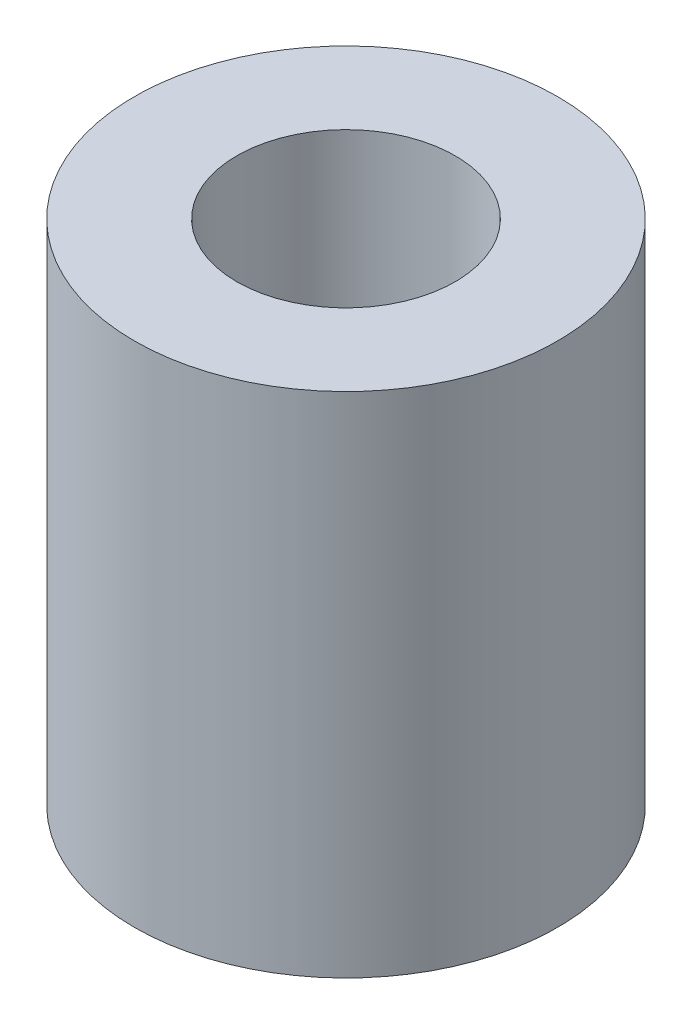
ISO-10303-21;
HEADER;
FILE_DESCRIPTION(('STEP AP214'),'2;1');
FILE_NAME('part.step','',(''),(''),'','','');
FILE_SCHEMA(('AUTOMOTIVE_DESIGN { 1 0 10303 214 1 1 1 1 }'));
ENDSEC;
DATA;
#1=APPLICATION_CONTEXT('core data for automotive mechanical design processes');
#2=APPLICATION_PROTOCOL_DEFINITION('international standard','automotive_design',2000,#1);
#3=PRODUCT_CONTEXT('',#1,'mechanical');
#4=PRODUCT('Part','Part','',(#3));
#5=PRODUCT_RELATED_PRODUCT_CATEGORY('part','',(#4));
#6=PRODUCT_DEFINITION_FORMATION('','',#4);
#7=PRODUCT_DEFINITION_CONTEXT('part definition',#1,'design');
#8=PRODUCT_DEFINITION('design','',#6,#7);
#9=PRODUCT_DEFINITION_SHAPE('','',#8);
#10=(LENGTH_UNIT() NAMED_UNIT(*) SI_UNIT(.MILLI.,.METRE.));
#11=(NAMED_UNIT(*) PLANE_ANGLE_UNIT() SI_UNIT($,.RADIAN.));
#12=(NAMED_UNIT(*) SI_UNIT($,.STERADIAN.) SOLID_ANGLE_UNIT());
#13=UNCERTAINTY_MEASURE_WITH_UNIT(LENGTH_MEASURE(1.E-05),#10,'distance_accuracy_value','');
#14=(GEOMETRIC_REPRESENTATION_CONTEXT(3) GLOBAL_UNCERTAINTY_ASSIGNED_CONTEXT((#13)) GLOBAL_UNIT_ASSIGNED_CONTEXT((#10,
#11,#12)) REPRESENTATION_CONTEXT('',''));
#15=CARTESIAN_POINT('',(0.,0.,0.));
#16=DIRECTION('',(0.,0.,1.));
#17=DIRECTION('',(1.,0.,0.));
#18=AXIS2_PLACEMENT_3D('',#15,#16,#17);
#19=CARTESIAN_POINT('',(0.,7.62,0.));
#20=DIRECTION('',(0.,-1.,0.));
#21=DIRECTION('',(0.,0.,-1.));
#22=AXIS2_PLACEMENT_3D('',#19,#20,#21);
#23=CYLINDRICAL_SURFACE('',#22,3.175);
#24=CARTESIAN_POINT('',(0.,7.62,0.));
#25=DIRECTION('',(0.,1.,0.));
#26=DIRECTION('',(0.,0.,1.));
#27=AXIS2_PLACEMENT_3D('',#24,#25,#26);
#28=CIRCLE('',#27,3.175);
#29=CARTESIAN_POINT('',(0.,7.62,-3.175));
#30=VERTEX_POINT('',#29);
#31=EDGE_CURVE('E10',#30,#30,#28,.T.);
#32=CARTESIAN_POINT('',(0.,0.,0.));
#33=DIRECTION('',(0.,1.,0.));
#34=DIRECTION('',(0.,0.,1.));
#35=AXIS2_PLACEMENT_3D('',#32,#33,#34);
#36=CIRCLE('',#35,3.175);
#37=CARTESIAN_POINT('',(0.,0.,-3.175));
#38=VERTEX_POINT('',#37);
#39=EDGE_CURVE('E35',#38,#38,#36,.T.);
#40=CARTESIAN_POINT('',(0.,7.62,-3.175));
#41=CARTESIAN_POINT('',(0.,7.540625,-3.175));
#42=CARTESIAN_POINT('',(0.,7.46125,-3.175));
#43=CARTESIAN_POINT('',(0.,7.3025,-3.175));
#44=CARTESIAN_POINT('',(0.,7.223125,-3.175));
#45=CARTESIAN_POINT('',(0.,7.064375,-3.175));
#46=CARTESIAN_POINT('',(0.,6.985,-3.175));
#47=CARTESIAN_POINT('',(0.,6.82625,-3.175));
#48=CARTESIAN_POINT('',(0.,6.746875,-3.175));
#49=CARTESIAN_POINT('',(0.,6.588125,-3.175));
#50=CARTESIAN_POINT('',(0.,6.50875,-3.175));
#51=CARTESIAN_POINT('',(0.,6.35,-3.175));
#52=CARTESIAN_POINT('',(0.,6.270625,-3.175));
#53=CARTESIAN_POINT('',(0.,6.111875,-3.175));
#54=CARTESIAN_POINT('',(0.,6.0325,-3.175));
#55=CARTESIAN_POINT('',(0.,5.87375,-3.175));
#56=CARTESIAN_POINT('',(0.,5.794375,-3.175));
#57=CARTESIAN_POINT('',(0.,5.635625,-3.175));
#58=CARTESIAN_POINT('',(0.,5.55625,-3.175));
#59=CARTESIAN_POINT('',(0.,5.3975,-3.175));
#60=CARTESIAN_POINT('',(0.,5.318125,-3.175));
#61=CARTESIAN_POINT('',(0.,5.159375,-3.175));
#62=CARTESIAN_POINT('',(0.,5.08,-3.175));
#63=CARTESIAN_POINT('',(0.,4.92125,-3.175));
#64=CARTESIAN_POINT('',(0.,4.841875,-3.175));
#65=CARTESIAN_POINT('',(0.,4.683125,-3.175));
#66=CARTESIAN_POINT('',(0.,4.60375,-3.175));
#67=CARTESIAN_POINT('',(0.,4.445,-3.175));
#68=CARTESIAN_POINT('',(0.,4.365625,-3.175));
#69=CARTESIAN_POINT('',(0.,4.206875,-3.175));
#70=CARTESIAN_POINT('',(0.,4.1275,-3.175));
#71=CARTESIAN_POINT('',(0.,3.96875,-3.175));
#72=CARTESIAN_POINT('',(0.,3.889375,-3.175));
#73=CARTESIAN_POINT('',(0.,3.730625,-3.175));
#74=CARTESIAN_POINT('',(0.,3.65125,-3.175));
#75=CARTESIAN_POINT('',(0.,3.4925,-3.175));
#76=CARTESIAN_POINT('',(0.,3.413125,-3.175));
#77=CARTESIAN_POINT('',(0.,3.254375,-3.175));
#78=CARTESIAN_POINT('',(0.,3.175,-3.175));
#79=CARTESIAN_POINT('',(0.,3.01625,-3.175));
#80=CARTESIAN_POINT('',(0.,2.936875,-3.175));
#81=CARTESIAN_POINT('',(0.,2.778125,-3.175));
#82=CARTESIAN_POINT('',(0.,2.69875,-3.175));
#83=CARTESIAN_POINT('',(0.,2.54,-3.175));
#84=CARTESIAN_POINT('',(0.,2.460625,-3.175));
#85=CARTESIAN_POINT('',(0.,2.301875,-3.175));
#86=CARTESIAN_POINT('',(0.,2.2225,-3.175));
#87=CARTESIAN_POINT('',(0.,2.06375,-3.175));
#88=CARTESIAN_POINT('',(0.,1.984375,-3.175));
#89=CARTESIAN_POINT('',(0.,1.825625,-3.175));
#90=CARTESIAN_POINT('',(0.,1.74625,-3.175));
#91=CARTESIAN_POINT('',(0.,1.5875,-3.175));
#92=CARTESIAN_POINT('',(0.,1.508125,-3.175));
#93=CARTESIAN_POINT('',(0.,1.349375,-3.175));
#94=CARTESIAN_POINT('',(0.,1.27,-3.175));
#95=CARTESIAN_POINT('',(0.,1.11125,-3.175));
#96=CARTESIAN_POINT('',(0.,1.031875,-3.175));
#97=CARTESIAN_POINT('',(0.,0.873125,-3.175));
#98=CARTESIAN_POINT('',(0.,0.79375,-3.175));
#99=CARTESIAN_POINT('',(0.,0.635,-3.175));
#100=CARTESIAN_POINT('',(0.,0.555625,-3.175));
#101=CARTESIAN_POINT('',(0.,0.396875,-3.175));
#102=CARTESIAN_POINT('',(0.,0.3175,-3.175));
#103=CARTESIAN_POINT('',(0.,0.15875,-3.175));
#104=CARTESIAN_POINT('',(0.,0.0793749999999999,-3.175));
#105=CARTESIAN_POINT('',(0.,0.,-3.175));
#106=B_SPLINE_CURVE_WITH_KNOTS('',3,(#40,#41,#42,#43,#44,#45,#46,#47,#48,#49,#50,#51,#52,#53,
#54,#55,#56,#57,#58,#59,#60,#61,#62,#63,#64,#65,#66,#67,#68,#69,#70,#71,#72,#73,#74,#75,#76,#77,
#78,#79,#80,#81,#82,#83,#84,#85,#86,#87,#88,#89,#90,#91,#92,#93,#94,#95,#96,#97,#98,#99,#100,
#101,#102,#103,#104,#105),.UNSPECIFIED.,.F.,.F.,(4,2,2,2,2,2,2,2,2,2,2,2,2,2,2,2,2,2,2,2,2,2,2,
2,2,2,2,2,2,2,2,2,4),(0.,0.238125,0.47625,0.714375000000001,0.9525,1.190625,1.42875,1.666875,
1.905,2.143125,2.38125,2.619375,2.8575,3.095625,3.33375,3.571875,3.81,4.048125,4.28625,4.524375,
4.7625,5.000625,5.23875,5.476875,5.715,5.953125,6.19125,6.429375,6.6675,6.905625,7.14375,
7.381875,7.62),.UNSPECIFIED.);
#107=EDGE_CURVE('BSEAM32',#30,#38,#106,.T.);
#108=ORIENTED_EDGE('',*,*,#31,.F.);
#109=ORIENTED_EDGE('',*,*,#39,.T.);
#110=ORIENTED_EDGE('',*,*,#107,.T.);
#111=ORIENTED_EDGE('',*,*,#107,.F.);
#112=EDGE_LOOP('',(#108,#110,#109,#111));
#113=FACE_BOUND('',#112,.T.);
#114=ADVANCED_FACE('F32',(#113),#23,.T.);
#115=CARTESIAN_POINT('',(0.,7.62,0.));
#116=DIRECTION('',(0.,1.,0.));
#117=DIRECTION('',(0.,0.,1.));
#118=AXIS2_PLACEMENT_3D('',#115,#116,#117);
#119=PLANE('',#118);
#120=CARTESIAN_POINT('',(0.,7.62,0.));
#121=DIRECTION('',(0.,1.,0.));
#122=DIRECTION('',(0.,0.,1.));
#123=AXIS2_PLACEMENT_3D('',#120,#121,#122);
#124=CIRCLE('',#123,1.6383);
#125=CARTESIAN_POINT('',(0.,7.62,1.6383));
#126=VERTEX_POINT('',#125);
#127=EDGE_CURVE('E44',#126,#126,#124,.T.);
#128=ORIENTED_EDGE('',*,*,#127,.F.);
#129=EDGE_LOOP('',(#128));
#130=FACE_BOUND('',#129,.T.);
#131=ORIENTED_EDGE('',*,*,#31,.T.);
#132=EDGE_LOOP('',(#131));
#133=FACE_BOUND('',#132,.T.);
#134=ADVANCED_FACE('F59',(#130,#133),#119,.T.);
#135=CARTESIAN_POINT('',(0.,0.,0.));
#136=DIRECTION('',(0.,1.,0.));
#137=DIRECTION('',(0.,0.,1.));
#138=AXIS2_PLACEMENT_3D('',#135,#136,#137);
#139=PLANE('',#138);
#140=ORIENTED_EDGE('',*,*,#39,.F.);
#141=EDGE_LOOP('',(#140));
#142=FACE_BOUND('',#141,.T.);
#143=ADVANCED_FACE('F55',(#142),#139,.F.);
#144=CARTESIAN_POINT('',(0.,2.54,0.));
#145=DIRECTION('',(0.,1.,0.));
#146=DIRECTION('',(0.,0.,1.));
#147=AXIS2_PLACEMENT_3D('',#144,#145,#146);
#148=CYLINDRICAL_SURFACE('',#147,1.6383);
#149=CARTESIAN_POINT('',(0.,2.54,0.));
#150=DIRECTION('',(0.,1.,0.));
#151=DIRECTION('',(0.,0.,1.));
#152=AXIS2_PLACEMENT_3D('',#149,#150,#151);
#153=CIRCLE('',#152,1.6383);
#154=CARTESIAN_POINT('',(0.,2.54,1.6383));
#155=VERTEX_POINT('',#154);
#156=EDGE_CURVE('E42',#155,#155,#153,.T.);
#157=ORIENTED_EDGE('',*,*,#156,.F.);
#158=EDGE_LOOP('',(#157));
#159=FACE_BOUND('',#158,.T.);
#160=ORIENTED_EDGE('',*,*,#127,.T.);
#161=EDGE_LOOP('',(#160));
#162=FACE_BOUND('',#161,.T.);
#163=ADVANCED_FACE('F52',(#159,#162),#148,.F.);
#164=CARTESIAN_POINT('',(0.,2.54,0.));
#165=DIRECTION('',(0.,1.,0.));
#166=DIRECTION('',(0.,0.,1.));
#167=AXIS2_PLACEMENT_3D('',#164,#165,#166);
#168=PLANE('',#167);
#169=ORIENTED_EDGE('',*,*,#156,.T.);
#170=EDGE_LOOP('',(#169));
#171=FACE_BOUND('',#170,.T.);
#172=ADVANCED_FACE('F50',(#171),#168,.T.);
#173=CLOSED_SHELL('',(#114,#134,#143,#163,#172));
#174=MANIFOLD_SOLID_BREP('B2',#173);
#175=ADVANCED_BREP_SHAPE_REPRESENTATION('',(#18,#174),#14);
#176=SHAPE_DEFINITION_REPRESENTATION(#9,#175);
ENDSEC;
END-ISO-10303-21;
